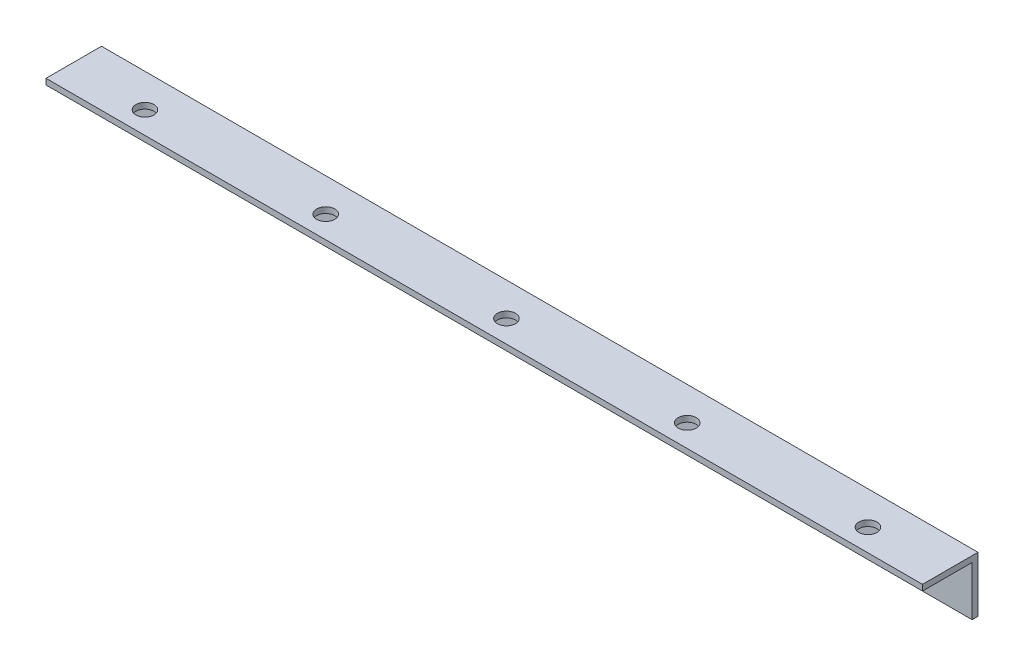
ISO-10303-21;
HEADER;
FILE_DESCRIPTION(('STEP AP214'),'2;1');
FILE_NAME('part.step','',(''),(''),'','','');
FILE_SCHEMA(('AUTOMOTIVE_DESIGN { 1 0 10303 214 1 1 1 1 }'));
ENDSEC;
DATA;
#1=APPLICATION_CONTEXT('core data for automotive mechanical design processes');
#2=APPLICATION_PROTOCOL_DEFINITION('international standard','automotive_design',2000,#1);
#3=PRODUCT_CONTEXT('',#1,'mechanical');
#4=PRODUCT('Part','Part','',(#3));
#5=PRODUCT_RELATED_PRODUCT_CATEGORY('part','',(#4));
#6=PRODUCT_DEFINITION_FORMATION('','',#4);
#7=PRODUCT_DEFINITION_CONTEXT('part definition',#1,'design');
#8=PRODUCT_DEFINITION('design','',#6,#7);
#9=PRODUCT_DEFINITION_SHAPE('','',#8);
#10=(LENGTH_UNIT() NAMED_UNIT(*) SI_UNIT(.MILLI.,.METRE.));
#11=(NAMED_UNIT(*) PLANE_ANGLE_UNIT() SI_UNIT($,.RADIAN.));
#12=(NAMED_UNIT(*) SI_UNIT($,.STERADIAN.) SOLID_ANGLE_UNIT());
#13=UNCERTAINTY_MEASURE_WITH_UNIT(LENGTH_MEASURE(1.E-05),#10,'distance_accuracy_value','');
#14=(GEOMETRIC_REPRESENTATION_CONTEXT(3) GLOBAL_UNCERTAINTY_ASSIGNED_CONTEXT((#13)) GLOBAL_UNIT_ASSIGNED_CONTEXT((#10,
#11,#12)) REPRESENTATION_CONTEXT('',''));
#15=CARTESIAN_POINT('',(0.,0.,0.));
#16=DIRECTION('',(0.,0.,1.));
#17=DIRECTION('',(1.,0.,0.));
#18=AXIS2_PLACEMENT_3D('',#15,#16,#17);
#19=CARTESIAN_POINT('',(-150.,45.,-225.));
#20=DIRECTION('',(1.,0.,0.));
#21=DIRECTION('',(0.,0.,-1.));
#22=AXIS2_PLACEMENT_3D('',#19,#20,#21);
#23=PLANE('',#22);
#24=DIRECTION('',(0.,0.,-1.));
#25=VECTOR('',#24,1.);
#26=CARTESIAN_POINT('',(-150.,47.,-225.));
#27=LINE('',#26,#25);
#28=CARTESIAN_POINT('',(-150.,47.,-203.));
#29=VERTEX_POINT('',#28);
#30=CARTESIAN_POINT('',(-150.,47.,-222.));
#31=VERTEX_POINT('',#30);
#32=EDGE_CURVE('E99',#29,#31,#27,.T.);
#33=ORIENTED_EDGE('',*,*,#32,.T.);
#34=DIRECTION('',(0.,-1.,0.));
#35=VECTOR('',#34,1.);
#36=CARTESIAN_POINT('',(-150.,50.,-222.));
#37=LINE('',#36,#35);
#38=CARTESIAN_POINT('',(-150.,28.,-222.));
#39=VERTEX_POINT('',#38);
#40=EDGE_CURVE('E102',#31,#39,#37,.T.);
#41=ORIENTED_EDGE('',*,*,#40,.T.);
#42=DIRECTION('',(0.,0.,-1.));
#43=VECTOR('',#42,1.);
#44=CARTESIAN_POINT('',(-150.,28.,-220.));
#45=LINE('',#44,#43);
#46=CARTESIAN_POINT('',(-150.,28.,-220.));
#47=VERTEX_POINT('',#46);
#48=EDGE_CURVE('E138',#47,#39,#45,.T.);
#49=ORIENTED_EDGE('',*,*,#48,.F.);
#50=DIRECTION('',(0.,-1.,0.));
#51=VECTOR('',#50,1.);
#52=CARTESIAN_POINT('',(-150.,50.,-220.));
#53=LINE('',#52,#51);
#54=CARTESIAN_POINT('',(-150.,45.,-220.));
#55=VERTEX_POINT('',#54);
#56=EDGE_CURVE('E133',#55,#47,#53,.T.);
#57=ORIENTED_EDGE('',*,*,#56,.F.);
#58=DIRECTION('',(0.,0.,-1.));
#59=VECTOR('',#58,1.);
#60=CARTESIAN_POINT('',(-150.,45.,-225.));
#61=LINE('',#60,#59);
#62=CARTESIAN_POINT('',(-150.,45.,-203.));
#63=VERTEX_POINT('',#62);
#64=EDGE_CURVE('E67',#63,#55,#61,.T.);
#65=ORIENTED_EDGE('',*,*,#64,.F.);
#66=DIRECTION('',(0.,1.,0.));
#67=VECTOR('',#66,1.);
#68=CARTESIAN_POINT('',(-150.,45.,-203.));
#69=LINE('',#68,#67);
#70=EDGE_CURVE('E105',#63,#29,#69,.T.);
#71=ORIENTED_EDGE('',*,*,#70,.T.);
#72=EDGE_LOOP('',(#33,#41,#49,#57,#65,#71));
#73=FACE_BOUND('',#72,.T.);
#74=ADVANCED_FACE('F45',(#73),#23,.F.);
#75=CARTESIAN_POINT('',(150.,45.,-225.));
#76=DIRECTION('',(-1.,0.,0.));
#77=DIRECTION('',(0.,0.,1.));
#78=AXIS2_PLACEMENT_3D('',#75,#76,#77);
#79=PLANE('',#78);
#80=DIRECTION('',(0.,1.,0.));
#81=VECTOR('',#80,1.);
#82=CARTESIAN_POINT('',(150.,50.,-222.));
#83=LINE('',#82,#81);
#84=CARTESIAN_POINT('',(150.,28.,-222.));
#85=VERTEX_POINT('',#84);
#86=CARTESIAN_POINT('',(150.,47.,-222.));
#87=VERTEX_POINT('',#86);
#88=EDGE_CURVE('E122',#85,#87,#83,.T.);
#89=ORIENTED_EDGE('',*,*,#88,.T.);
#90=DIRECTION('',(0.,0.,1.));
#91=VECTOR('',#90,1.);
#92=CARTESIAN_POINT('',(150.,47.,-225.));
#93=LINE('',#92,#91);
#94=CARTESIAN_POINT('',(150.,47.,-203.));
#95=VERTEX_POINT('',#94);
#96=EDGE_CURVE('E59',#87,#95,#93,.T.);
#97=ORIENTED_EDGE('',*,*,#96,.T.);
#98=DIRECTION('',(0.,1.,0.));
#99=VECTOR('',#98,1.);
#100=CARTESIAN_POINT('',(150.,45.,-203.));
#101=LINE('',#100,#99);
#102=CARTESIAN_POINT('',(150.,45.,-203.));
#103=VERTEX_POINT('',#102);
#104=EDGE_CURVE('E53',#103,#95,#101,.T.);
#105=ORIENTED_EDGE('',*,*,#104,.F.);
#106=DIRECTION('',(0.,0.,1.));
#107=VECTOR('',#106,1.);
#108=CARTESIAN_POINT('',(150.,45.,-225.));
#109=LINE('',#108,#107);
#110=CARTESIAN_POINT('',(150.,45.,-220.));
#111=VERTEX_POINT('',#110);
#112=EDGE_CURVE('E185',#111,#103,#109,.T.);
#113=ORIENTED_EDGE('',*,*,#112,.F.);
#114=DIRECTION('',(0.,1.,0.));
#115=VECTOR('',#114,1.);
#116=CARTESIAN_POINT('',(150.,50.,-220.));
#117=LINE('',#116,#115);
#118=CARTESIAN_POINT('',(150.,28.,-220.));
#119=VERTEX_POINT('',#118);
#120=EDGE_CURVE('E128',#119,#111,#117,.T.);
#121=ORIENTED_EDGE('',*,*,#120,.F.);
#122=DIRECTION('',(0.,0.,-1.));
#123=VECTOR('',#122,1.);
#124=CARTESIAN_POINT('',(150.,28.,-220.));
#125=LINE('',#124,#123);
#126=EDGE_CURVE('E134',#119,#85,#125,.T.);
#127=ORIENTED_EDGE('',*,*,#126,.T.);
#128=EDGE_LOOP('',(#89,#97,#105,#113,#121,#127));
#129=FACE_BOUND('',#128,.T.);
#130=ADVANCED_FACE('F204',(#129),#79,.F.);
#131=CARTESIAN_POINT('',(0.,0.,-222.));
#132=DIRECTION('',(0.,0.,1.));
#133=DIRECTION('',(1.,0.,0.));
#134=AXIS2_PLACEMENT_3D('',#131,#132,#133);
#135=PLANE('',#134);
#136=CARTESIAN_POINT('',(-123.733333333333,35.6000000000009,-222.));
#137=DIRECTION('',(0.,0.,1.));
#138=DIRECTION('',(1.,0.,0.));
#139=AXIS2_PLACEMENT_3D('',#136,#137,#138);
#140=CIRCLE('',#139,3.09999999999993);
#141=CARTESIAN_POINT('',(-120.633333333333,35.6000000000009,-222.));
#142=VERTEX_POINT('',#141);
#143=EDGE_CURVE('E246',#142,#142,#140,.T.);
#144=ORIENTED_EDGE('',*,*,#143,.T.);
#145=EDGE_LOOP('',(#144));
#146=FACE_BOUND('',#145,.T.);
#147=CARTESIAN_POINT('',(-61.8666666666666,35.6000000000017,-222.));
#148=DIRECTION('',(0.,0.,1.));
#149=DIRECTION('',(1.,0.,0.));
#150=AXIS2_PLACEMENT_3D('',#147,#148,#149);
#151=CIRCLE('',#150,3.09999999999993);
#152=CARTESIAN_POINT('',(-58.7666666666667,35.6000000000017,-222.));
#153=VERTEX_POINT('',#152);
#154=EDGE_CURVE('E238',#153,#153,#151,.T.);
#155=ORIENTED_EDGE('',*,*,#154,.T.);
#156=EDGE_LOOP('',(#155));
#157=FACE_BOUND('',#156,.T.);
#158=CARTESIAN_POINT('',(0.,35.6000000000026,-222.));
#159=DIRECTION('',(0.,0.,1.));
#160=DIRECTION('',(1.,0.,0.));
#161=AXIS2_PLACEMENT_3D('',#158,#159,#160);
#162=CIRCLE('',#161,3.09999999999999);
#163=CARTESIAN_POINT('',(3.09999999999999,35.6000000000026,-222.));
#164=VERTEX_POINT('',#163);
#165=EDGE_CURVE('E230',#164,#164,#162,.T.);
#166=ORIENTED_EDGE('',*,*,#165,.T.);
#167=EDGE_LOOP('',(#166));
#168=FACE_BOUND('',#167,.T.);
#169=CARTESIAN_POINT('',(61.8666666666666,35.6000000000035,-222.));
#170=DIRECTION('',(0.,0.,1.));
#171=DIRECTION('',(1.,0.,0.));
#172=AXIS2_PLACEMENT_3D('',#169,#170,#171);
#173=CIRCLE('',#172,3.09999999999993);
#174=CARTESIAN_POINT('',(64.9666666666665,35.6000000000035,-222.));
#175=VERTEX_POINT('',#174);
#176=EDGE_CURVE('E222',#175,#175,#173,.T.);
#177=ORIENTED_EDGE('',*,*,#176,.T.);
#178=EDGE_LOOP('',(#177));
#179=FACE_BOUND('',#178,.T.);
#180=CARTESIAN_POINT('',(123.733333333333,35.6000000000043,-222.));
#181=DIRECTION('',(0.,0.,1.));
#182=DIRECTION('',(1.,0.,0.));
#183=AXIS2_PLACEMENT_3D('',#180,#181,#182);
#184=CIRCLE('',#183,3.09999999999993);
#185=CARTESIAN_POINT('',(126.833333333333,35.6000000000043,-222.));
#186=VERTEX_POINT('',#185);
#187=EDGE_CURVE('E125',#186,#186,#184,.T.);
#188=ORIENTED_EDGE('',*,*,#187,.T.);
#189=EDGE_LOOP('',(#188));
#190=FACE_BOUND('',#189,.T.);
#191=DIRECTION('',(-1.,0.,0.));
#192=VECTOR('',#191,1.);
#193=CARTESIAN_POINT('',(0.,47.,-222.));
#194=LINE('',#193,#192);
#195=EDGE_CURVE('E11',#87,#31,#194,.T.);
#196=ORIENTED_EDGE('',*,*,#195,.F.);
#197=ORIENTED_EDGE('',*,*,#88,.F.);
#198=DIRECTION('',(1.,0.,0.));
#199=VECTOR('',#198,1.);
#200=CARTESIAN_POINT('',(-150.,28.,-222.));
#201=LINE('',#200,#199);
#202=EDGE_CURVE('E115',#39,#85,#201,.T.);
#203=ORIENTED_EDGE('',*,*,#202,.F.);
#204=ORIENTED_EDGE('',*,*,#40,.F.);
#205=EDGE_LOOP('',(#196,#197,#203,#204));
#206=FACE_BOUND('',#205,.T.);
#207=ADVANCED_FACE('F114',(#146,#157,#168,#179,#190,#206),#135,.F.);
#208=CARTESIAN_POINT('',(0.,45.,0.));
#209=DIRECTION('',(0.,1.,0.));
#210=DIRECTION('',(0.,0.,1.));
#211=AXIS2_PLACEMENT_3D('',#208,#209,#210);
#212=PLANE('',#211);
#213=ORIENTED_EDGE('',*,*,#64,.T.);
#214=DIRECTION('',(1.,0.,0.));
#215=VECTOR('',#214,1.);
#216=CARTESIAN_POINT('',(0.,45.,-220.));
#217=LINE('',#216,#215);
#218=EDGE_CURVE('E141',#55,#111,#217,.T.);
#219=ORIENTED_EDGE('',*,*,#218,.T.);
#220=ORIENTED_EDGE('',*,*,#112,.T.);
#221=DIRECTION('',(-1.,0.,0.));
#222=VECTOR('',#221,1.);
#223=CARTESIAN_POINT('',(-150.,45.,-203.));
#224=LINE('',#223,#222);
#225=EDGE_CURVE('E189',#103,#63,#224,.T.);
#226=ORIENTED_EDGE('',*,*,#225,.T.);
#227=EDGE_LOOP('',(#213,#219,#220,#226));
#228=FACE_BOUND('',#227,.T.);
#229=CARTESIAN_POINT('',(123.733333333333,45.,-210.6));
#230=DIRECTION('',(0.,-1.,0.));
#231=DIRECTION('',(0.,0.,-1.));
#232=AXIS2_PLACEMENT_3D('',#229,#230,#231);
#233=CIRCLE('',#232,3.10000000000014);
#234=CARTESIAN_POINT('',(123.733333333333,45.,-213.7));
#235=VERTEX_POINT('',#234);
#236=EDGE_CURVE('E107',#235,#235,#233,.T.);
#237=ORIENTED_EDGE('',*,*,#236,.F.);
#238=EDGE_LOOP('',(#237));
#239=FACE_BOUND('',#238,.T.);
#240=CARTESIAN_POINT('',(61.8666666666666,45.,-210.6));
#241=DIRECTION('',(0.,-1.,0.));
#242=DIRECTION('',(0.,0.,-1.));
#243=AXIS2_PLACEMENT_3D('',#240,#241,#242);
#244=CIRCLE('',#243,3.10000000000009);
#245=CARTESIAN_POINT('',(61.8666666666666,45.,-213.7));
#246=VERTEX_POINT('',#245);
#247=EDGE_CURVE('E169',#246,#246,#244,.T.);
#248=ORIENTED_EDGE('',*,*,#247,.F.);
#249=EDGE_LOOP('',(#248));
#250=FACE_BOUND('',#249,.T.);
#251=CARTESIAN_POINT('',(0.,45.,-210.6));
#252=DIRECTION('',(0.,-1.,0.));
#253=DIRECTION('',(0.,0.,-1.));
#254=AXIS2_PLACEMENT_3D('',#251,#252,#253);
#255=CIRCLE('',#254,3.10000000000001);
#256=CARTESIAN_POINT('',(0.,45.,-213.7));
#257=VERTEX_POINT('',#256);
#258=EDGE_CURVE('E161',#257,#257,#255,.T.);
#259=ORIENTED_EDGE('',*,*,#258,.F.);
#260=EDGE_LOOP('',(#259));
#261=FACE_BOUND('',#260,.T.);
#262=CARTESIAN_POINT('',(-61.8666666666666,45.,-210.6));
#263=DIRECTION('',(0.,-1.,0.));
#264=DIRECTION('',(0.,0.,-1.));
#265=AXIS2_PLACEMENT_3D('',#262,#263,#264);
#266=CIRCLE('',#265,3.09999999999996);
#267=CARTESIAN_POINT('',(-61.8666666666666,45.,-213.7));
#268=VERTEX_POINT('',#267);
#269=EDGE_CURVE('E153',#268,#268,#266,.T.);
#270=ORIENTED_EDGE('',*,*,#269,.F.);
#271=EDGE_LOOP('',(#270));
#272=FACE_BOUND('',#271,.T.);
#273=CARTESIAN_POINT('',(-123.733333333333,45.,-210.6));
#274=DIRECTION('',(0.,-1.,0.));
#275=DIRECTION('',(0.,0.,-1.));
#276=AXIS2_PLACEMENT_3D('',#273,#274,#275);
#277=CIRCLE('',#276,3.09999999999989);
#278=CARTESIAN_POINT('',(-123.733333333333,45.,-213.7));
#279=VERTEX_POINT('',#278);
#280=EDGE_CURVE('E145',#279,#279,#277,.T.);
#281=ORIENTED_EDGE('',*,*,#280,.F.);
#282=EDGE_LOOP('',(#281));
#283=FACE_BOUND('',#282,.T.);
#284=ADVANCED_FACE('F262',(#228,#239,#250,#261,#272,#283),#212,.F.);
#285=CARTESIAN_POINT('',(0.,47.,0.));
#286=DIRECTION('',(0.,1.,0.));
#287=DIRECTION('',(0.,0.,1.));
#288=AXIS2_PLACEMENT_3D('',#285,#286,#287);
#289=PLANE('',#288);
#290=ORIENTED_EDGE('',*,*,#96,.F.);
#291=ORIENTED_EDGE('',*,*,#195,.T.);
#292=ORIENTED_EDGE('',*,*,#32,.F.);
#293=DIRECTION('',(-1.,0.,0.));
#294=VECTOR('',#293,1.);
#295=CARTESIAN_POINT('',(-150.,47.,-203.));
#296=LINE('',#295,#294);
#297=EDGE_CURVE('E186',#95,#29,#296,.T.);
#298=ORIENTED_EDGE('',*,*,#297,.F.);
#299=EDGE_LOOP('',(#290,#291,#292,#298));
#300=FACE_BOUND('',#299,.T.);
#301=CARTESIAN_POINT('',(-61.8666666666666,47.,-210.6));
#302=DIRECTION('',(0.,-1.,0.));
#303=DIRECTION('',(0.,0.,-1.));
#304=AXIS2_PLACEMENT_3D('',#301,#302,#303);
#305=CIRCLE('',#304,3.09999999999996);
#306=CARTESIAN_POINT('',(-61.8666666666666,47.,-213.7));
#307=VERTEX_POINT('',#306);
#308=EDGE_CURVE('E149',#307,#307,#305,.T.);
#309=ORIENTED_EDGE('',*,*,#308,.T.);
#310=EDGE_LOOP('',(#309));
#311=FACE_BOUND('',#310,.T.);
#312=CARTESIAN_POINT('',(61.8666666666666,47.,-210.6));
#313=DIRECTION('',(0.,-1.,0.));
#314=DIRECTION('',(0.,0.,-1.));
#315=AXIS2_PLACEMENT_3D('',#312,#313,#314);
#316=CIRCLE('',#315,3.10000000000009);
#317=CARTESIAN_POINT('',(61.8666666666666,47.,-213.7));
#318=VERTEX_POINT('',#317);
#319=EDGE_CURVE('E165',#318,#318,#316,.T.);
#320=ORIENTED_EDGE('',*,*,#319,.T.);
#321=EDGE_LOOP('',(#320));
#322=FACE_BOUND('',#321,.T.);
#323=CARTESIAN_POINT('',(123.733333333333,47.,-210.6));
#324=DIRECTION('',(0.,-1.,0.));
#325=DIRECTION('',(0.,0.,-1.));
#326=AXIS2_PLACEMENT_3D('',#323,#324,#325);
#327=CIRCLE('',#326,3.10000000000014);
#328=CARTESIAN_POINT('',(123.733333333333,47.,-213.7));
#329=VERTEX_POINT('',#328);
#330=EDGE_CURVE('E173',#329,#329,#327,.T.);
#331=ORIENTED_EDGE('',*,*,#330,.T.);
#332=EDGE_LOOP('',(#331));
#333=FACE_BOUND('',#332,.T.);
#334=CARTESIAN_POINT('',(0.,47.,-210.6));
#335=DIRECTION('',(0.,-1.,0.));
#336=DIRECTION('',(0.,0.,-1.));
#337=AXIS2_PLACEMENT_3D('',#334,#335,#336);
#338=CIRCLE('',#337,3.10000000000001);
#339=CARTESIAN_POINT('',(0.,47.,-213.7));
#340=VERTEX_POINT('',#339);
#341=EDGE_CURVE('E157',#340,#340,#338,.T.);
#342=ORIENTED_EDGE('',*,*,#341,.T.);
#343=EDGE_LOOP('',(#342));
#344=FACE_BOUND('',#343,.T.);
#345=CARTESIAN_POINT('',(-123.733333333333,47.,-210.6));
#346=DIRECTION('',(0.,-1.,0.));
#347=DIRECTION('',(0.,0.,-1.));
#348=AXIS2_PLACEMENT_3D('',#345,#346,#347);
#349=CIRCLE('',#348,3.09999999999989);
#350=CARTESIAN_POINT('',(-123.733333333333,47.,-213.7));
#351=VERTEX_POINT('',#350);
#352=EDGE_CURVE('E144',#351,#351,#349,.T.);
#353=ORIENTED_EDGE('',*,*,#352,.T.);
#354=EDGE_LOOP('',(#353));
#355=FACE_BOUND('',#354,.T.);
#356=ADVANCED_FACE('F109',(#300,#311,#322,#333,#344,#355),#289,.T.);
#357=CARTESIAN_POINT('',(-150.,45.,-203.));
#358=DIRECTION('',(0.,0.,-1.));
#359=DIRECTION('',(-1.,0.,0.));
#360=AXIS2_PLACEMENT_3D('',#357,#358,#359);
#361=PLANE('',#360);
#362=ORIENTED_EDGE('',*,*,#297,.T.);
#363=ORIENTED_EDGE('',*,*,#70,.F.);
#364=ORIENTED_EDGE('',*,*,#225,.F.);
#365=ORIENTED_EDGE('',*,*,#104,.T.);
#366=EDGE_LOOP('',(#362,#363,#364,#365));
#367=FACE_BOUND('',#366,.T.);
#368=ADVANCED_FACE('F202',(#367),#361,.F.);
#369=CARTESIAN_POINT('',(123.733333333333,45.,-210.6));
#370=DIRECTION('',(0.,1.,0.));
#371=DIRECTION('',(0.,0.,1.));
#372=AXIS2_PLACEMENT_3D('',#369,#370,#371);
#373=CYLINDRICAL_SURFACE('',#372,3.10000000000014);
#374=ORIENTED_EDGE('',*,*,#236,.T.);
#375=EDGE_LOOP('',(#374));
#376=FACE_BOUND('',#375,.T.);
#377=ORIENTED_EDGE('',*,*,#330,.F.);
#378=EDGE_LOOP('',(#377));
#379=FACE_BOUND('',#378,.T.);
#380=ADVANCED_FACE('F288',(#376,#379),#373,.F.);
#381=CARTESIAN_POINT('',(61.8666666666666,45.,-210.6));
#382=DIRECTION('',(0.,1.,0.));
#383=DIRECTION('',(0.,0.,1.));
#384=AXIS2_PLACEMENT_3D('',#381,#382,#383);
#385=CYLINDRICAL_SURFACE('',#384,3.10000000000009);
#386=ORIENTED_EDGE('',*,*,#247,.T.);
#387=EDGE_LOOP('',(#386));
#388=FACE_BOUND('',#387,.T.);
#389=ORIENTED_EDGE('',*,*,#319,.F.);
#390=EDGE_LOOP('',(#389));
#391=FACE_BOUND('',#390,.T.);
#392=ADVANCED_FACE('F313',(#388,#391),#385,.F.);
#393=CARTESIAN_POINT('',(0.,45.,-210.6));
#394=DIRECTION('',(0.,1.,0.));
#395=DIRECTION('',(0.,0.,1.));
#396=AXIS2_PLACEMENT_3D('',#393,#394,#395);
#397=CYLINDRICAL_SURFACE('',#396,3.10000000000001);
#398=ORIENTED_EDGE('',*,*,#258,.T.);
#399=EDGE_LOOP('',(#398));
#400=FACE_BOUND('',#399,.T.);
#401=ORIENTED_EDGE('',*,*,#341,.F.);
#402=EDGE_LOOP('',(#401));
#403=FACE_BOUND('',#402,.T.);
#404=ADVANCED_FACE('F309',(#400,#403),#397,.F.);
#405=CARTESIAN_POINT('',(-61.8666666666666,45.,-210.6));
#406=DIRECTION('',(0.,1.,0.));
#407=DIRECTION('',(0.,0.,1.));
#408=AXIS2_PLACEMENT_3D('',#405,#406,#407);
#409=CYLINDRICAL_SURFACE('',#408,3.09999999999996);
#410=ORIENTED_EDGE('',*,*,#269,.T.);
#411=EDGE_LOOP('',(#410));
#412=FACE_BOUND('',#411,.T.);
#413=ORIENTED_EDGE('',*,*,#308,.F.);
#414=EDGE_LOOP('',(#413));
#415=FACE_BOUND('',#414,.T.);
#416=ADVANCED_FACE('F278',(#412,#415),#409,.F.);
#417=CARTESIAN_POINT('',(-123.733333333333,45.,-210.6));
#418=DIRECTION('',(0.,1.,0.));
#419=DIRECTION('',(0.,0.,1.));
#420=AXIS2_PLACEMENT_3D('',#417,#418,#419);
#421=CYLINDRICAL_SURFACE('',#420,3.09999999999989);
#422=ORIENTED_EDGE('',*,*,#280,.T.);
#423=EDGE_LOOP('',(#422));
#424=FACE_BOUND('',#423,.T.);
#425=ORIENTED_EDGE('',*,*,#352,.F.);
#426=EDGE_LOOP('',(#425));
#427=FACE_BOUND('',#426,.T.);
#428=ADVANCED_FACE('F259',(#424,#427),#421,.F.);
#429=CARTESIAN_POINT('',(0.,0.,-220.));
#430=DIRECTION('',(0.,0.,1.));
#431=DIRECTION('',(1.,0.,0.));
#432=AXIS2_PLACEMENT_3D('',#429,#430,#431);
#433=PLANE('',#432);
#434=CARTESIAN_POINT('',(-61.8666666666666,35.6000000000017,-220.));
#435=DIRECTION('',(0.,0.,1.));
#436=DIRECTION('',(1.,0.,0.));
#437=AXIS2_PLACEMENT_3D('',#434,#435,#436);
#438=CIRCLE('',#437,3.09999999999993);
#439=CARTESIAN_POINT('',(-58.7666666666667,35.6000000000017,-220.));
#440=VERTEX_POINT('',#439);
#441=EDGE_CURVE('E234',#440,#440,#438,.T.);
#442=ORIENTED_EDGE('',*,*,#441,.F.);
#443=EDGE_LOOP('',(#442));
#444=FACE_BOUND('',#443,.T.);
#445=CARTESIAN_POINT('',(61.8666666666666,35.6000000000035,-220.));
#446=DIRECTION('',(0.,0.,1.));
#447=DIRECTION('',(1.,0.,0.));
#448=AXIS2_PLACEMENT_3D('',#445,#446,#447);
#449=CIRCLE('',#448,3.09999999999993);
#450=CARTESIAN_POINT('',(64.9666666666665,35.6000000000035,-220.));
#451=VERTEX_POINT('',#450);
#452=EDGE_CURVE('E220',#451,#451,#449,.T.);
#453=ORIENTED_EDGE('',*,*,#452,.F.);
#454=EDGE_LOOP('',(#453));
#455=FACE_BOUND('',#454,.T.);
#456=CARTESIAN_POINT('',(123.733333333333,35.6000000000043,-220.));
#457=DIRECTION('',(0.,0.,1.));
#458=DIRECTION('',(1.,0.,0.));
#459=AXIS2_PLACEMENT_3D('',#456,#457,#458);
#460=CIRCLE('',#459,3.09999999999993);
#461=CARTESIAN_POINT('',(126.833333333333,35.6000000000043,-220.));
#462=VERTEX_POINT('',#461);
#463=EDGE_CURVE('E118',#462,#462,#460,.T.);
#464=ORIENTED_EDGE('',*,*,#463,.F.);
#465=EDGE_LOOP('',(#464));
#466=FACE_BOUND('',#465,.T.);
#467=CARTESIAN_POINT('',(0.,35.6000000000026,-220.));
#468=DIRECTION('',(0.,0.,1.));
#469=DIRECTION('',(1.,0.,0.));
#470=AXIS2_PLACEMENT_3D('',#467,#468,#469);
#471=CIRCLE('',#470,3.09999999999999);
#472=CARTESIAN_POINT('',(3.09999999999999,35.6000000000026,-220.));
#473=VERTEX_POINT('',#472);
#474=EDGE_CURVE('E226',#473,#473,#471,.T.);
#475=ORIENTED_EDGE('',*,*,#474,.F.);
#476=EDGE_LOOP('',(#475));
#477=FACE_BOUND('',#476,.T.);
#478=CARTESIAN_POINT('',(-123.733333333333,35.6000000000009,-220.));
#479=DIRECTION('',(0.,0.,1.));
#480=DIRECTION('',(1.,0.,0.));
#481=AXIS2_PLACEMENT_3D('',#478,#479,#480);
#482=CIRCLE('',#481,3.09999999999993);
#483=CARTESIAN_POINT('',(-120.633333333333,35.6000000000009,-220.));
#484=VERTEX_POINT('',#483);
#485=EDGE_CURVE('E242',#484,#484,#482,.T.);
#486=ORIENTED_EDGE('',*,*,#485,.F.);
#487=EDGE_LOOP('',(#486));
#488=FACE_BOUND('',#487,.T.);
#489=ORIENTED_EDGE('',*,*,#218,.F.);
#490=ORIENTED_EDGE('',*,*,#56,.T.);
#491=DIRECTION('',(1.,0.,0.));
#492=VECTOR('',#491,1.);
#493=CARTESIAN_POINT('',(-150.,28.,-220.));
#494=LINE('',#493,#492);
#495=EDGE_CURVE('E211',#47,#119,#494,.T.);
#496=ORIENTED_EDGE('',*,*,#495,.T.);
#497=ORIENTED_EDGE('',*,*,#120,.T.);
#498=EDGE_LOOP('',(#489,#490,#496,#497));
#499=FACE_BOUND('',#498,.T.);
#500=ADVANCED_FACE('F257',(#444,#455,#466,#477,#488,#499),#433,.T.);
#501=CARTESIAN_POINT('',(-150.,28.,-220.));
#502=DIRECTION('',(0.,1.,0.));
#503=DIRECTION('',(-1.,0.,0.));
#504=AXIS2_PLACEMENT_3D('',#501,#502,#503);
#505=PLANE('',#504);
#506=ORIENTED_EDGE('',*,*,#202,.T.);
#507=ORIENTED_EDGE('',*,*,#126,.F.);
#508=ORIENTED_EDGE('',*,*,#495,.F.);
#509=ORIENTED_EDGE('',*,*,#48,.T.);
#510=EDGE_LOOP('',(#506,#507,#508,#509));
#511=FACE_BOUND('',#510,.T.);
#512=ADVANCED_FACE('F210',(#511),#505,.F.);
#513=CARTESIAN_POINT('',(123.733333333333,35.6000000000043,-220.));
#514=DIRECTION('',(0.,0.,-1.));
#515=DIRECTION('',(-1.,0.,0.));
#516=AXIS2_PLACEMENT_3D('',#513,#514,#515);
#517=CYLINDRICAL_SURFACE('',#516,3.09999999999993);
#518=ORIENTED_EDGE('',*,*,#463,.T.);
#519=EDGE_LOOP('',(#518));
#520=FACE_BOUND('',#519,.T.);
#521=ORIENTED_EDGE('',*,*,#187,.F.);
#522=EDGE_LOOP('',(#521));
#523=FACE_BOUND('',#522,.T.);
#524=ADVANCED_FACE('F305',(#520,#523),#517,.F.);
#525=CARTESIAN_POINT('',(61.8666666666666,35.6000000000035,-220.));
#526=DIRECTION('',(0.,0.,-1.));
#527=DIRECTION('',(-1.,0.,0.));
#528=AXIS2_PLACEMENT_3D('',#525,#526,#527);
#529=CYLINDRICAL_SURFACE('',#528,3.09999999999993);
#530=ORIENTED_EDGE('',*,*,#452,.T.);
#531=EDGE_LOOP('',(#530));
#532=FACE_BOUND('',#531,.T.);
#533=ORIENTED_EDGE('',*,*,#176,.F.);
#534=EDGE_LOOP('',(#533));
#535=FACE_BOUND('',#534,.T.);
#536=ADVANCED_FACE('F373',(#532,#535),#529,.F.);
#537=CARTESIAN_POINT('',(0.,35.6000000000026,-220.));
#538=DIRECTION('',(0.,0.,-1.));
#539=DIRECTION('',(-1.,0.,0.));
#540=AXIS2_PLACEMENT_3D('',#537,#538,#539);
#541=CYLINDRICAL_SURFACE('',#540,3.09999999999999);
#542=ORIENTED_EDGE('',*,*,#474,.T.);
#543=EDGE_LOOP('',(#542));
#544=FACE_BOUND('',#543,.T.);
#545=ORIENTED_EDGE('',*,*,#165,.F.);
#546=EDGE_LOOP('',(#545));
#547=FACE_BOUND('',#546,.T.);
#548=ADVANCED_FACE('F381',(#544,#547),#541,.F.);
#549=CARTESIAN_POINT('',(-61.8666666666666,35.6000000000017,-220.));
#550=DIRECTION('',(0.,0.,-1.));
#551=DIRECTION('',(-1.,0.,0.));
#552=AXIS2_PLACEMENT_3D('',#549,#550,#551);
#553=CYLINDRICAL_SURFACE('',#552,3.09999999999993);
#554=ORIENTED_EDGE('',*,*,#441,.T.);
#555=EDGE_LOOP('',(#554));
#556=FACE_BOUND('',#555,.T.);
#557=ORIENTED_EDGE('',*,*,#154,.F.);
#558=EDGE_LOOP('',(#557));
#559=FACE_BOUND('',#558,.T.);
#560=ADVANCED_FACE('F390',(#556,#559),#553,.F.);
#561=CARTESIAN_POINT('',(-123.733333333333,35.6000000000009,-220.));
#562=DIRECTION('',(0.,0.,-1.));
#563=DIRECTION('',(-1.,0.,0.));
#564=AXIS2_PLACEMENT_3D('',#561,#562,#563);
#565=CYLINDRICAL_SURFACE('',#564,3.09999999999993);
#566=ORIENTED_EDGE('',*,*,#485,.T.);
#567=EDGE_LOOP('',(#566));
#568=FACE_BOUND('',#567,.T.);
#569=ORIENTED_EDGE('',*,*,#143,.F.);
#570=EDGE_LOOP('',(#569));
#571=FACE_BOUND('',#570,.T.);
#572=ADVANCED_FACE('F254',(#568,#571),#565,.F.);
#573=CLOSED_SHELL('',(#74,#130,#207,#284,#356,#368,#380,#392,#404,#416,#428,#500,#512,#524,#536,
#548,#560,#572));
#574=MANIFOLD_SOLID_BREP('B2',#573);
#575=ADVANCED_BREP_SHAPE_REPRESENTATION('',(#18,#574),#14);
#576=SHAPE_DEFINITION_REPRESENTATION(#9,#575);
ENDSEC;
END-ISO-10303-21;
